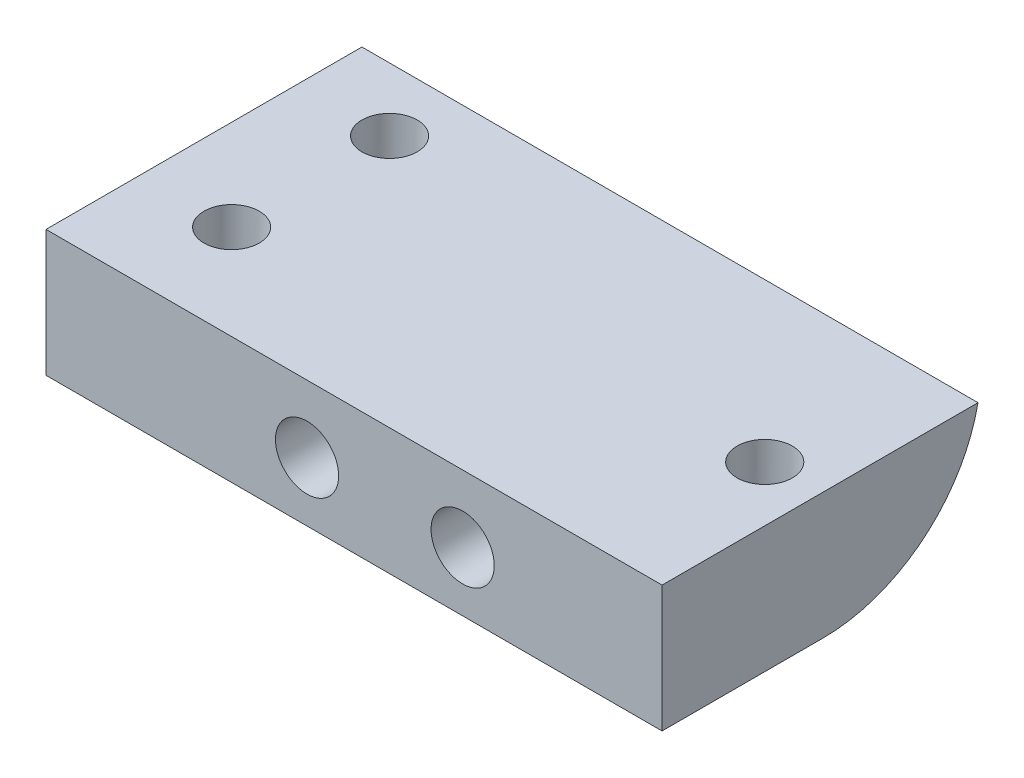
ISO-10303-21;
HEADER;
FILE_DESCRIPTION(('STEP AP214'),'2;1');
FILE_NAME('part.step','',(''),(''),'','','');
FILE_SCHEMA(('AUTOMOTIVE_DESIGN { 1 0 10303 214 1 1 1 1 }'));
ENDSEC;
DATA;
#1=APPLICATION_CONTEXT('core data for automotive mechanical design processes');
#2=APPLICATION_PROTOCOL_DEFINITION('international standard','automotive_design',2000,#1);
#3=PRODUCT_CONTEXT('',#1,'mechanical');
#4=PRODUCT('Part','Part','',(#3));
#5=PRODUCT_RELATED_PRODUCT_CATEGORY('part','',(#4));
#6=PRODUCT_DEFINITION_FORMATION('','',#4);
#7=PRODUCT_DEFINITION_CONTEXT('part definition',#1,'design');
#8=PRODUCT_DEFINITION('design','',#6,#7);
#9=PRODUCT_DEFINITION_SHAPE('','',#8);
#10=(LENGTH_UNIT() NAMED_UNIT(*) SI_UNIT(.MILLI.,.METRE.));
#11=(NAMED_UNIT(*) PLANE_ANGLE_UNIT() SI_UNIT($,.RADIAN.));
#12=(NAMED_UNIT(*) SI_UNIT($,.STERADIAN.) SOLID_ANGLE_UNIT());
#13=UNCERTAINTY_MEASURE_WITH_UNIT(LENGTH_MEASURE(1.E-05),#10,'distance_accuracy_value','');
#14=(GEOMETRIC_REPRESENTATION_CONTEXT(3) GLOBAL_UNCERTAINTY_ASSIGNED_CONTEXT((#13)) GLOBAL_UNIT_ASSIGNED_CONTEXT((#10,
#11,#12)) REPRESENTATION_CONTEXT('',''));
#15=CARTESIAN_POINT('',(0.,0.,0.));
#16=DIRECTION('',(0.,0.,1.));
#17=DIRECTION('',(1.,0.,0.));
#18=AXIS2_PLACEMENT_3D('',#15,#16,#17);
#19=CARTESIAN_POINT('',(-0.885282092778937,3.79686795239579,4.));
#20=DIRECTION('',(0.,1.,0.));
#21=DIRECTION('',(0.,0.,1.));
#22=AXIS2_PLACEMENT_3D('',#19,#20,#21);
#23=CYLINDRICAL_SURFACE('',#22,1.75);
#24=CARTESIAN_POINT('',(-0.885282092778937,11.7978679523958,4.));
#25=DIRECTION('',(0.,1.,0.));
#26=DIRECTION('',(0.,0.,1.));
#27=AXIS2_PLACEMENT_3D('',#24,#25,#26);
#28=CIRCLE('',#27,1.75);
#29=CARTESIAN_POINT('',(-0.885282092778937,11.7978679523958,5.75));
#30=VERTEX_POINT('',#29);
#31=EDGE_CURVE('E199',#30,#30,#28,.T.);
#32=ORIENTED_EDGE('',*,*,#31,.T.);
#33=EDGE_LOOP('',(#32));
#34=FACE_BOUND('',#33,.T.);
#35=CARTESIAN_POINT('',(-0.885282092778937,7.79786795239579,4.));
#36=DIRECTION('',(0.,-1.,0.));
#37=DIRECTION('',(0.,0.,-1.));
#38=AXIS2_PLACEMENT_3D('',#35,#36,#37);
#39=CIRCLE('',#38,1.75);
#40=CARTESIAN_POINT('',(-0.885282092778937,7.79786795239579,2.25));
#41=VERTEX_POINT('',#40);
#42=EDGE_CURVE('E195',#41,#41,#39,.F.);
#43=ORIENTED_EDGE('',*,*,#42,.F.);
#44=EDGE_LOOP('',(#43));
#45=FACE_BOUND('',#44,.T.);
#46=ADVANCED_FACE('F33',(#34,#45),#23,.F.);
#47=CARTESIAN_POINT('',(-0.885282092778937,3.79686795239579,14.));
#48=DIRECTION('',(0.,1.,0.));
#49=DIRECTION('',(0.,0.,1.));
#50=AXIS2_PLACEMENT_3D('',#47,#48,#49);
#51=CYLINDRICAL_SURFACE('',#50,1.75);
#52=CARTESIAN_POINT('',(-0.885282092778937,11.7978679523958,14.));
#53=DIRECTION('',(0.,1.,0.));
#54=DIRECTION('',(0.,0.,1.));
#55=AXIS2_PLACEMENT_3D('',#52,#53,#54);
#56=CIRCLE('',#55,1.75);
#57=CARTESIAN_POINT('',(-0.885282092778937,11.7978679523958,15.75));
#58=VERTEX_POINT('',#57);
#59=EDGE_CURVE('E213',#58,#58,#56,.T.);
#60=ORIENTED_EDGE('',*,*,#59,.T.);
#61=EDGE_LOOP('',(#60));
#62=FACE_BOUND('',#61,.T.);
#63=CARTESIAN_POINT('',(-0.885282092778937,7.79786795239579,14.));
#64=DIRECTION('',(0.,-1.,0.));
#65=DIRECTION('',(0.,0.,-1.));
#66=AXIS2_PLACEMENT_3D('',#63,#64,#65);
#67=CIRCLE('',#66,1.75);
#68=CARTESIAN_POINT('',(-0.885282092778937,7.79786795239579,12.25));
#69=VERTEX_POINT('',#68);
#70=EDGE_CURVE('E38',#69,#69,#67,.F.);
#71=ORIENTED_EDGE('',*,*,#70,.F.);
#72=EDGE_LOOP('',(#71));
#73=FACE_BOUND('',#72,.T.);
#74=ADVANCED_FACE('F160',(#62,#73),#51,.F.);
#75=CARTESIAN_POINT('',(28.8647179072211,3.79686795239579,10.));
#76=DIRECTION('',(0.,1.,0.));
#77=DIRECTION('',(0.,0.,1.));
#78=AXIS2_PLACEMENT_3D('',#75,#76,#77);
#79=CYLINDRICAL_SURFACE('',#78,1.75);
#80=CARTESIAN_POINT('',(28.8647179072211,11.7978679523958,10.));
#81=DIRECTION('',(0.,1.,0.));
#82=DIRECTION('',(0.,0.,1.));
#83=AXIS2_PLACEMENT_3D('',#80,#81,#82);
#84=CIRCLE('',#83,1.75);
#85=CARTESIAN_POINT('',(28.8647179072211,11.7978679523958,11.75));
#86=VERTEX_POINT('',#85);
#87=EDGE_CURVE('E210',#86,#86,#84,.T.);
#88=ORIENTED_EDGE('',*,*,#87,.T.);
#89=EDGE_LOOP('',(#88));
#90=FACE_BOUND('',#89,.T.);
#91=CARTESIAN_POINT('',(28.8647179072211,7.79786795239579,10.));
#92=DIRECTION('',(0.,-1.,0.));
#93=DIRECTION('',(0.,0.,-1.));
#94=AXIS2_PLACEMENT_3D('',#91,#92,#93);
#95=CIRCLE('',#94,1.75);
#96=CARTESIAN_POINT('',(28.8647179072211,7.79786795239579,8.25));
#97=VERTEX_POINT('',#96);
#98=EDGE_CURVE('E193',#97,#97,#95,.F.);
#99=ORIENTED_EDGE('',*,*,#98,.F.);
#100=EDGE_LOOP('',(#99));
#101=FACE_BOUND('',#100,.T.);
#102=ADVANCED_FACE('F143',(#90,#101),#79,.F.);
#103=CARTESIAN_POINT('',(0.,0.,20.));
#104=DIRECTION('',(0.,0.,1.));
#105=DIRECTION('',(1.,0.,0.));
#106=AXIS2_PLACEMENT_3D('',#103,#104,#105);
#107=PLANE('',#106);
#108=CARTESIAN_POINT('',(9.88971790722106,7.54786795239579,20.));
#109=DIRECTION('',(0.,0.,1.));
#110=DIRECTION('',(1.,0.,0.));
#111=AXIS2_PLACEMENT_3D('',#108,#109,#110);
#112=CIRCLE('',#111,2.);
#113=CARTESIAN_POINT('',(11.8897179072211,7.54786795239579,20.));
#114=VERTEX_POINT('',#113);
#115=EDGE_CURVE('E123',#114,#114,#112,.T.);
#116=ORIENTED_EDGE('',*,*,#115,.F.);
#117=EDGE_LOOP('',(#116));
#118=FACE_BOUND('',#117,.T.);
#119=DIRECTION('',(0.,-1.,0.));
#120=VECTOR('',#119,1.);
#121=CARTESIAN_POINT('',(-6.63528209277894,11.7978679523958,20.));
#122=LINE('',#121,#120);
#123=CARTESIAN_POINT('',(-6.63528209277894,11.7978679523958,20.));
#124=VERTEX_POINT('',#123);
#125=CARTESIAN_POINT('',(-6.63528209277894,3.79786795239579,20.));
#126=VERTEX_POINT('',#125);
#127=EDGE_CURVE('E222',#124,#126,#122,.T.);
#128=ORIENTED_EDGE('',*,*,#127,.T.);
#129=DIRECTION('',(1.,0.,0.));
#130=VECTOR('',#129,1.);
#131=CARTESIAN_POINT('',(-6.63528209277894,3.79786795239579,20.));
#132=LINE('',#131,#130);
#133=CARTESIAN_POINT('',(32.3647179072211,3.79786795239579,20.));
#134=VERTEX_POINT('',#133);
#135=EDGE_CURVE('E225',#126,#134,#132,.T.);
#136=ORIENTED_EDGE('',*,*,#135,.T.);
#137=DIRECTION('',(0.,1.,0.));
#138=VECTOR('',#137,1.);
#139=CARTESIAN_POINT('',(32.3647179072211,11.7978679523958,20.));
#140=LINE('',#139,#138);
#141=CARTESIAN_POINT('',(32.3647179072211,11.7978679523958,20.));
#142=VERTEX_POINT('',#141);
#143=EDGE_CURVE('E227',#134,#142,#140,.T.);
#144=ORIENTED_EDGE('',*,*,#143,.T.);
#145=DIRECTION('',(-1.,0.,0.));
#146=VECTOR('',#145,1.);
#147=CARTESIAN_POINT('',(-6.63528209277894,11.7978679523958,20.));
#148=LINE('',#147,#146);
#149=EDGE_CURVE('E229',#142,#124,#148,.T.);
#150=ORIENTED_EDGE('',*,*,#149,.T.);
#151=EDGE_LOOP('',(#128,#136,#144,#150));
#152=FACE_BOUND('',#151,.T.);
#153=CARTESIAN_POINT('',(19.7397179072211,7.54786795239579,20.));
#154=DIRECTION('',(0.,0.,1.));
#155=DIRECTION('',(1.,0.,0.));
#156=AXIS2_PLACEMENT_3D('',#153,#154,#155);
#157=CIRCLE('',#156,2.);
#158=CARTESIAN_POINT('',(21.7397179072211,7.54786795239579,20.));
#159=VERTEX_POINT('',#158);
#160=EDGE_CURVE('E124',#159,#159,#157,.T.);
#161=ORIENTED_EDGE('',*,*,#160,.F.);
#162=EDGE_LOOP('',(#161));
#163=FACE_BOUND('',#162,.T.);
#164=ADVANCED_FACE('F139',(#118,#152,#163),#107,.T.);
#165=CARTESIAN_POINT('',(-6.63528209277894,11.7978679523958,20.));
#166=DIRECTION('',(1.,0.,0.));
#167=DIRECTION('',(0.,1.,0.));
#168=AXIS2_PLACEMENT_3D('',#165,#166,#167);
#169=PLANE('',#168);
#170=DIRECTION('',(0.,0.,-1.));
#171=VECTOR('',#170,1.);
#172=CARTESIAN_POINT('',(-6.63528209277894,11.7978679523958,20.));
#173=LINE('',#172,#171);
#174=CARTESIAN_POINT('',(-6.63528209277894,11.7978679523958,0.));
#175=VERTEX_POINT('',#174);
#176=EDGE_CURVE('E231',#124,#175,#173,.T.);
#177=ORIENTED_EDGE('',*,*,#176,.T.);
#178=CARTESIAN_POINT('',(-6.63528209277894,13.7978679523958,9.79795897113271));
#179=DIRECTION('',(1.,0.,0.));
#180=DIRECTION('',(0.,1.,0.));
#181=AXIS2_PLACEMENT_3D('',#178,#179,#180);
#182=CIRCLE('',#181,10.);
#183=CARTESIAN_POINT('',(-6.63528209277894,3.79786795239579,9.79795897113271));
#184=VERTEX_POINT('',#183);
#185=EDGE_CURVE('E92',#175,#184,#182,.F.);
#186=ORIENTED_EDGE('',*,*,#185,.T.);
#187=DIRECTION('',(0.,0.,-1.));
#188=VECTOR('',#187,1.);
#189=CARTESIAN_POINT('',(-6.63528209277894,3.79786795239579,20.));
#190=LINE('',#189,#188);
#191=EDGE_CURVE('E107',#126,#184,#190,.T.);
#192=ORIENTED_EDGE('',*,*,#191,.F.);
#193=ORIENTED_EDGE('',*,*,#127,.F.);
#194=EDGE_LOOP('',(#177,#186,#192,#193));
#195=FACE_BOUND('',#194,.T.);
#196=ADVANCED_FACE('F142',(#195),#169,.F.);
#197=CARTESIAN_POINT('',(-6.63528209277894,3.79786795239579,20.));
#198=DIRECTION('',(0.,1.,0.));
#199=DIRECTION('',(0.,0.,1.));
#200=AXIS2_PLACEMENT_3D('',#197,#198,#199);
#201=PLANE('',#200);
#202=CARTESIAN_POINT('',(-0.885282092778937,3.79786795239579,14.));
#203=DIRECTION('',(0.,-1.,0.));
#204=DIRECTION('',(0.,0.,-1.));
#205=AXIS2_PLACEMENT_3D('',#202,#203,#204);
#206=CIRCLE('',#205,3.1);
#207=CARTESIAN_POINT('',(-0.885282092778937,3.79786795239579,10.9));
#208=VERTEX_POINT('',#207);
#209=EDGE_CURVE('E206',#208,#208,#206,.T.);
#210=ORIENTED_EDGE('',*,*,#209,.F.);
#211=EDGE_LOOP('',(#210));
#212=FACE_BOUND('',#211,.T.);
#213=DIRECTION('',(1.,0.,0.));
#214=VECTOR('',#213,1.);
#215=CARTESIAN_POINT('',(-6.63528209277894,3.79786795239579,9.79795897113271));
#216=LINE('',#215,#214);
#217=CARTESIAN_POINT('',(25.771308877905,3.79786795239579,9.79795897113271));
#218=VERTEX_POINT('',#217);
#219=EDGE_CURVE('E100',#184,#218,#216,.T.);
#220=ORIENTED_EDGE('',*,*,#219,.T.);
#221=CARTESIAN_POINT('',(28.8647179072211,3.79786795239579,10.));
#222=DIRECTION('',(0.,-1.,0.));
#223=DIRECTION('',(0.,0.,-1.));
#224=AXIS2_PLACEMENT_3D('',#221,#222,#223);
#225=CIRCLE('',#224,3.1);
#226=CARTESIAN_POINT('',(31.9581269365371,3.79786795239579,9.79795897113271));
#227=VERTEX_POINT('',#226);
#228=EDGE_CURVE('E56',#227,#218,#225,.T.);
#229=ORIENTED_EDGE('',*,*,#228,.F.);
#230=DIRECTION('',(1.,0.,0.));
#231=VECTOR('',#230,1.);
#232=CARTESIAN_POINT('',(-6.63528209277894,3.79786795239579,9.79795897113271));
#233=LINE('',#232,#231);
#234=CARTESIAN_POINT('',(32.3647179072211,3.79786795239579,9.79795897113271));
#235=VERTEX_POINT('',#234);
#236=EDGE_CURVE('E97',#227,#235,#233,.T.);
#237=ORIENTED_EDGE('',*,*,#236,.T.);
#238=DIRECTION('',(0.,0.,-1.));
#239=VECTOR('',#238,1.);
#240=CARTESIAN_POINT('',(32.3647179072211,3.79786795239579,20.));
#241=LINE('',#240,#239);
#242=EDGE_CURVE('E110',#134,#235,#241,.T.);
#243=ORIENTED_EDGE('',*,*,#242,.F.);
#244=ORIENTED_EDGE('',*,*,#135,.F.);
#245=ORIENTED_EDGE('',*,*,#191,.T.);
#246=EDGE_LOOP('',(#220,#229,#237,#243,#244,#245));
#247=FACE_BOUND('',#246,.T.);
#248=ADVANCED_FACE('F95',(#212,#247),#201,.F.);
#249=CARTESIAN_POINT('',(32.3647179072211,11.7978679523958,20.));
#250=DIRECTION('',(-1.,0.,0.));
#251=DIRECTION('',(0.,0.,1.));
#252=AXIS2_PLACEMENT_3D('',#249,#250,#251);
#253=PLANE('',#252);
#254=ORIENTED_EDGE('',*,*,#242,.T.);
#255=CARTESIAN_POINT('',(32.3647179072211,13.7978679523958,9.79795897113271));
#256=DIRECTION('',(-1.,0.,0.));
#257=DIRECTION('',(0.,0.,1.));
#258=AXIS2_PLACEMENT_3D('',#255,#256,#257);
#259=CIRCLE('',#258,10.);
#260=CARTESIAN_POINT('',(32.3647179072211,11.7978679523958,0.));
#261=VERTEX_POINT('',#260);
#262=EDGE_CURVE('E106',#235,#261,#259,.F.);
#263=ORIENTED_EDGE('',*,*,#262,.T.);
#264=DIRECTION('',(0.,0.,-1.));
#265=VECTOR('',#264,1.);
#266=CARTESIAN_POINT('',(32.3647179072211,11.7978679523958,20.));
#267=LINE('',#266,#265);
#268=EDGE_CURVE('E234',#142,#261,#267,.T.);
#269=ORIENTED_EDGE('',*,*,#268,.F.);
#270=ORIENTED_EDGE('',*,*,#143,.F.);
#271=EDGE_LOOP('',(#254,#263,#269,#270));
#272=FACE_BOUND('',#271,.T.);
#273=ADVANCED_FACE('F147',(#272),#253,.F.);
#274=CARTESIAN_POINT('',(-6.63528209277894,11.7978679523958,20.));
#275=DIRECTION('',(0.,-1.,0.));
#276=DIRECTION('',(0.,0.,-1.));
#277=AXIS2_PLACEMENT_3D('',#274,#275,#276);
#278=PLANE('',#277);
#279=ORIENTED_EDGE('',*,*,#87,.F.);
#280=EDGE_LOOP('',(#279));
#281=FACE_BOUND('',#280,.T.);
#282=ORIENTED_EDGE('',*,*,#59,.F.);
#283=EDGE_LOOP('',(#282));
#284=FACE_BOUND('',#283,.T.);
#285=ORIENTED_EDGE('',*,*,#31,.F.);
#286=EDGE_LOOP('',(#285));
#287=FACE_BOUND('',#286,.T.);
#288=DIRECTION('',(-1.,0.,0.));
#289=VECTOR('',#288,1.);
#290=CARTESIAN_POINT('',(-6.63528209277894,11.7978679523958,0.));
#291=LINE('',#290,#289);
#292=EDGE_CURVE('E221',#261,#175,#291,.T.);
#293=ORIENTED_EDGE('',*,*,#292,.T.);
#294=ORIENTED_EDGE('',*,*,#176,.F.);
#295=ORIENTED_EDGE('',*,*,#149,.F.);
#296=ORIENTED_EDGE('',*,*,#268,.T.);
#297=EDGE_LOOP('',(#293,#294,#295,#296));
#298=FACE_BOUND('',#297,.T.);
#299=ADVANCED_FACE('F135',(#281,#284,#287,#298),#278,.F.);
#300=CARTESIAN_POINT('',(9.88971790722106,7.54786795239579,20.));
#301=DIRECTION('',(0.,0.,-1.));
#302=DIRECTION('',(-1.,0.,0.));
#303=AXIS2_PLACEMENT_3D('',#300,#301,#302);
#304=CYLINDRICAL_SURFACE('',#303,2.);
#305=ORIENTED_EDGE('',*,*,#115,.T.);
#306=EDGE_LOOP('',(#305));
#307=FACE_BOUND('',#306,.T.);
#308=CARTESIAN_POINT('',(8.06706713452882,8.37124159832121,1.39845146097099));
#309=CARTESIAN_POINT('',(8.03684840403237,8.30434313191308,1.44167383921874));
#310=CARTESIAN_POINT('',(8.01070371922054,8.23664322015132,1.48655043794439));
#311=CARTESIAN_POINT('',(7.96628275027579,8.10061553952446,1.57919229547365));
#312=CARTESIAN_POINT('',(7.94801321392808,8.03228728325485,1.62695999169866));
#313=CARTESIAN_POINT('',(7.90437238311397,7.82711414357992,1.77434663642538));
#314=CARTESIAN_POINT('',(7.89034402169671,7.69048724323069,1.87778849023849));
#315=CARTESIAN_POINT('',(7.88906368612502,7.40811192355309,2.10333011330868));
#316=CARTESIAN_POINT('',(7.90494558743367,7.26302650368383,2.22622799586738));
#317=CARTESIAN_POINT('',(7.96568742907636,6.98343871907239,2.47684024413229));
#318=CARTESIAN_POINT('',(8.0105585403283,6.84894045648772,2.60455644869467));
#319=CARTESIAN_POINT('',(8.09804184445983,6.65626652154989,2.79753029846761));
#320=CARTESIAN_POINT('',(8.13085053201474,6.59316860126641,2.86252167073016));
#321=CARTESIAN_POINT('',(8.20315124999806,6.47057706504911,2.99217144525225));
#322=CARTESIAN_POINT('',(8.24264071200764,6.41108207586274,3.0568299656698));
#323=CARTESIAN_POINT('',(8.32828315761671,6.2960452169771,3.18508731754283));
#324=CARTESIAN_POINT('',(8.37442861469255,6.24049898658284,3.24868725661778));
#325=CARTESIAN_POINT('',(8.47360444702865,6.13367892559521,3.3740208944851));
#326=CARTESIAN_POINT('',(8.5266308510256,6.08240265844842,3.43575564460868));
#327=CARTESIAN_POINT('',(8.64902642423236,5.97680849475583,3.56585616683012));
#328=CARTESIAN_POINT('',(8.71965348019377,5.92330461898732,3.63371425686979));
#329=CARTESIAN_POINT('',(8.87165787449071,5.82398218637763,3.76275036923891));
#330=CARTESIAN_POINT('',(8.95302139950198,5.77815392332547,3.82393679352143));
#331=CARTESIAN_POINT('',(9.10605828855624,5.70635824440362,3.92171765583146));
#332=CARTESIAN_POINT('',(9.1752129500256,5.67827653517361,3.96066281357448));
#333=CARTESIAN_POINT('',(9.32019681286711,5.62915141059759,4.02960892405375));
#334=CARTESIAN_POINT('',(9.39601376439686,5.60809540567515,4.0596258649391));
#335=CARTESIAN_POINT('',(9.53701188650633,5.57818192620844,4.10258308748956));
#336=CARTESIAN_POINT('',(9.60115333173919,5.56770282164011,4.11777038933889));
#337=CARTESIAN_POINT('',(9.73162331195037,5.5530493587498,4.13905979123538));
#338=CARTESIAN_POINT('',(9.79794959120912,5.54886869398012,4.14517097884901));
#339=CARTESIAN_POINT('',(9.9310185609371,5.5471855948123,4.14762763393258));
#340=CARTESIAN_POINT('',(9.99776184146238,5.54969760797718,4.14395197443057));
#341=CARTESIAN_POINT('',(10.129495552086,5.56118947051188,4.12722494813168));
#342=CARTESIAN_POINT('',(10.1944844417527,5.5701748236472,4.11416560315909));
#343=CARTESIAN_POINT('',(10.3365924075314,5.59678492783064,4.0758181088091));
#344=CARTESIAN_POINT('',(10.4128133687158,5.61598027784545,4.04832702137449));
#345=CARTESIAN_POINT('',(10.558870638318,5.66156962265168,3.98399262587635));
#346=CARTESIAN_POINT('',(10.6286933269441,5.68797851814815,3.94712997041408));
#347=CARTESIAN_POINT('',(10.796875764961,5.76197518714132,3.84563732242049));
#348=CARTESIAN_POINT('',(10.8908660112933,5.81338723672818,3.77661589534837));
#349=CARTESIAN_POINT('',(11.0649277912908,5.92623990535108,3.62980594626759));
#350=CARTESIAN_POINT('',(11.1449641295273,5.98770514625471,3.55199604843084));
#351=CARTESIAN_POINT('',(11.2742359123618,6.10266136958501,3.41125981483677));
#352=CARTESIAN_POINT('',(11.3262076065718,6.15440143610911,3.34937346253681));
#353=CARTESIAN_POINT('',(11.4233395343652,6.26207361634839,3.223870407996));
#354=CARTESIAN_POINT('',(11.4684965630168,6.31800768410363,3.16025290809567));
#355=CARTESIAN_POINT('',(11.5521820380131,6.4337262588288,3.03209812992432));
#356=CARTESIAN_POINT('',(11.5907070106654,6.49351276120705,2.96756038870168));
#357=CARTESIAN_POINT('',(11.661109769403,6.61663244317661,2.83822839985937));
#358=CARTESIAN_POINT('',(11.6929850519517,6.67996694720942,2.7734340649564));
#359=CARTESIAN_POINT('',(11.7796131969431,6.87757946250146,2.57684561230161));
#360=CARTESIAN_POINT('',(11.8236903165677,7.01714715268273,2.44544097528138));
#361=CARTESIAN_POINT('',(11.8806523094256,7.30715715388089,2.18822099898585));
#362=CARTESIAN_POINT('',(11.8935877802272,7.45758141540277,2.06239691967642));
#363=CARTESIAN_POINT('',(11.8849827321834,7.72885849223791,1.84876949120459));
#364=CARTESIAN_POINT('',(11.8708189939144,7.84836891350585,1.75897195597682));
#365=CARTESIAN_POINT('',(11.8192962610595,8.08795393541835,1.5870817578377));
#366=CARTESIAN_POINT('',(11.7819661239353,8.20802764999484,1.50497965526388));
#367=CARTESIAN_POINT('',(11.6902681564626,8.42512892739424,1.3630470051313));
#368=CARTESIAN_POINT('',(11.6396013579732,8.52275967673197,1.3017575280009));
#369=CARTESIAN_POINT('',(11.5201091781366,8.71160729000116,1.18737714739777));
#370=CARTESIAN_POINT('',(11.451288263743,8.80282572474656,1.13428423218822));
#371=CARTESIAN_POINT('',(11.2954996380895,8.97522672132363,1.0371368117435));
#372=CARTESIAN_POINT('',(11.2084218706267,9.05634343060684,0.99314049295234));
#373=CARTESIAN_POINT('',(11.0182555167431,9.20341028579624,0.915509810037765));
#374=CARTESIAN_POINT('',(10.9151755318249,9.2693685327005,0.881869907949883));
#375=CARTESIAN_POINT('',(10.7089068072316,9.37565936029879,0.828722392969982));
#376=CARTESIAN_POINT('',(10.6070846536291,9.41806256008998,0.808036921413673));
#377=CARTESIAN_POINT('',(10.396581196682,9.48572544987975,0.775384197319473));
#378=CARTESIAN_POINT('',(10.2879031337039,9.5109931733865,0.763412859200562));
#379=CARTESIAN_POINT('',(10.0749956447425,9.54196774307373,0.748783188174038));
#380=CARTESIAN_POINT('',(9.97098548825754,9.54891728229886,0.745532918261145));
#381=CARTESIAN_POINT('',(9.76319917015645,9.54656265622635,0.7466382147233));
#382=CARTESIAN_POINT('',(9.65942296807273,9.53726155912013,0.750992345354106));
#383=CARTESIAN_POINT('',(9.45712501358356,9.50316489374229,0.767130358772276));
#384=CARTESIAN_POINT('',(9.35854061593182,9.47867044646765,0.778769890130435));
#385=CARTESIAN_POINT('',(9.16722198191219,9.41552612890989,0.809282733511133));
#386=CARTESIAN_POINT('',(9.0744873559411,9.37687720250473,0.828155563191969));
#387=CARTESIAN_POINT('',(8.89564975609166,9.28627249757092,0.873380466979585));
#388=CARTESIAN_POINT('',(8.80968911000281,9.23409826550997,0.899856176480283));
#389=CARTESIAN_POINT('',(8.64809221646538,9.11892492256977,0.959876673364413));
#390=CARTESIAN_POINT('',(8.57246120689919,9.05592035621934,0.993425025327038));
#391=CARTESIAN_POINT('',(8.42876445055972,8.91758910333795,1.06930218852977));
#392=CARTESIAN_POINT('',(8.36139724817969,8.84175805283822,1.11202900056343));
#393=CARTESIAN_POINT('',(8.24049755832887,8.68363485707528,1.20418431327085));
#394=CARTESIAN_POINT('',(8.18694959305393,8.60135007603825,1.25360522095985));
#395=CARTESIAN_POINT('',(8.11365787760933,8.46908610848271,1.33584830049209));
#396=CARTESIAN_POINT('',(8.08926348362562,8.42038005285062,1.36670363501602));
#397=CARTESIAN_POINT('',(8.06706713452882,8.37124159832121,1.39845146097099));
#398=B_SPLINE_CURVE_WITH_KNOTS('',3,(#308,#309,#310,#311,#312,#313,#314,#315,#316,#317,#318,
#319,#320,#321,#322,#323,#324,#325,#326,#327,#328,#329,#330,#331,#332,#333,#334,#335,#336,#337,
#338,#339,#340,#341,#342,#343,#344,#345,#346,#347,#348,#349,#350,#351,#352,#353,#354,#355,#356,
#357,#358,#359,#360,#361,#362,#363,#364,#365,#366,#367,#368,#369,#370,#371,#372,#373,#374,#375,
#376,#377,#378,#379,#380,#381,#382,#383,#384,#385,#386,#387,#388,#389,#390,#391,#392,#393,#394,
#395,#396,#397),.UNSPECIFIED.,.T.,.F.,(4,2,2,2,2,2,2,2,2,2,2,2,2,2,2,2,2,2,2,2,2,2,2,2,2,2,2,2,
2,2,2,2,2,2,2,2,2,2,2,2,2,2,2,2,4),(0.,0.255491071982921,0.511200627260808,1.02413565654776,
1.59381515462571,2.163714308285,2.45250019619512,2.74117531183391,3.02952651946682,
3.31771204242053,3.65174783012232,3.98535796970025,4.23713480346648,4.48845801675372,
4.68784643525911,4.8870350788481,5.08665406152812,5.28644296493177,5.53486488228596,
5.78380388611113,6.16402622927968,6.545194139023,6.83271548200721,7.12037162744736,
7.40817798402832,7.69609250182189,8.28338586514439,8.86972437438288,9.31849455623655,
9.76670684190924,10.1429061897785,10.5190130572383,10.8974559531392,11.2756961285114,
11.6105842934499,11.9453153463191,12.2566727940372,12.5679714624558,12.8732893003509,
13.178586782123,13.4891611212393,13.7998923642037,14.1287473566934,14.457232411074,
14.6448964502869),.UNSPECIFIED.);
#399=CARTESIAN_POINT('',(8.06706713452882,8.37124159832121,1.39845146097099));
#400=VERTEX_POINT('',#399);
#401=EDGE_CURVE('E116',#400,#400,#398,.T.);
#402=ORIENTED_EDGE('',*,*,#401,.F.);
#403=EDGE_LOOP('',(#402));
#404=FACE_BOUND('',#403,.T.);
#405=ADVANCED_FACE('F130',(#307,#404),#304,.F.);
#406=CARTESIAN_POINT('',(19.7397179072211,7.54786795239579,20.));
#407=DIRECTION('',(0.,0.,-1.));
#408=DIRECTION('',(-1.,0.,0.));
#409=AXIS2_PLACEMENT_3D('',#406,#407,#408);
#410=CYLINDRICAL_SURFACE('',#409,2.);
#411=ORIENTED_EDGE('',*,*,#160,.T.);
#412=EDGE_LOOP('',(#411));
#413=FACE_BOUND('',#412,.T.);
#414=CARTESIAN_POINT('',(17.9170671345288,8.37124159832121,1.39845146097099));
#415=CARTESIAN_POINT('',(17.8868484040324,8.30434313191308,1.44167383921874));
#416=CARTESIAN_POINT('',(17.8607037192205,8.23664322015131,1.48655043794439));
#417=CARTESIAN_POINT('',(17.8162827502758,8.10061553952446,1.57919229547365));
#418=CARTESIAN_POINT('',(17.7980132139281,8.03228728325485,1.62695999169866));
#419=CARTESIAN_POINT('',(17.754372383114,7.82711414357992,1.77434663642539));
#420=CARTESIAN_POINT('',(17.7403440216967,7.69048724323069,1.87778849023849));
#421=CARTESIAN_POINT('',(17.739063686125,7.40811192355309,2.10333011330868));
#422=CARTESIAN_POINT('',(17.7549455874337,7.26302650368383,2.22622799586739));
#423=CARTESIAN_POINT('',(17.8156874290764,6.98343871907239,2.4768402441323));
#424=CARTESIAN_POINT('',(17.8605585403283,6.84894045648772,2.60455644869467));
#425=CARTESIAN_POINT('',(17.9480418444598,6.65626652154989,2.79753029846761));
#426=CARTESIAN_POINT('',(17.9808505320147,6.59316860126641,2.86252167073016));
#427=CARTESIAN_POINT('',(18.0531512499981,6.47057706504911,2.99217144525225));
#428=CARTESIAN_POINT('',(18.0926407120076,6.41108207586274,3.0568299656698));
#429=CARTESIAN_POINT('',(18.1782831576167,6.29604521697709,3.18508731754284));
#430=CARTESIAN_POINT('',(18.2244286146926,6.24049898658284,3.24868725661778));
#431=CARTESIAN_POINT('',(18.3236044470286,6.13367892559521,3.3740208944851));
#432=CARTESIAN_POINT('',(18.3766308510256,6.08240265844842,3.43575564460868));
#433=CARTESIAN_POINT('',(18.4990264242324,5.97680849475583,3.56585616683012));
#434=CARTESIAN_POINT('',(18.5696534801938,5.92330461898732,3.63371425686979));
#435=CARTESIAN_POINT('',(18.7216578744907,5.82398218637763,3.76275036923891));
#436=CARTESIAN_POINT('',(18.803021399502,5.77815392332546,3.82393679352144));
#437=CARTESIAN_POINT('',(18.9560582885562,5.70635824440362,3.92171765583146));
#438=CARTESIAN_POINT('',(19.0252129500256,5.67827653517361,3.96066281357448));
#439=CARTESIAN_POINT('',(19.1701968128671,5.62915141059759,4.02960892405375));
#440=CARTESIAN_POINT('',(19.2460137643968,5.60809540567515,4.0596258649391));
#441=CARTESIAN_POINT('',(19.3870118865063,5.57818192620844,4.10258308748956));
#442=CARTESIAN_POINT('',(19.4511533317392,5.56770282164011,4.11777038933889));
#443=CARTESIAN_POINT('',(19.5816233119504,5.5530493587498,4.13905979123538));
#444=CARTESIAN_POINT('',(19.6479495912091,5.54886869398012,4.14517097884901));
#445=CARTESIAN_POINT('',(19.7810185609371,5.5471855948123,4.14762763393258));
#446=CARTESIAN_POINT('',(19.8477618414624,5.54969760797718,4.14395197443057));
#447=CARTESIAN_POINT('',(19.979495552086,5.56118947051188,4.12722494813168));
#448=CARTESIAN_POINT('',(20.0444844417527,5.5701748236472,4.1141656031591));
#449=CARTESIAN_POINT('',(20.1865924075314,5.59678492783063,4.0758181088091));
#450=CARTESIAN_POINT('',(20.2628133687158,5.61598027784545,4.04832702137449));
#451=CARTESIAN_POINT('',(20.408870638318,5.66156962265168,3.98399262587635));
#452=CARTESIAN_POINT('',(20.4786933269441,5.68797851814815,3.94712997041408));
#453=CARTESIAN_POINT('',(20.6468757649609,5.76197518714132,3.84563732242049));
#454=CARTESIAN_POINT('',(20.7408660112933,5.81338723672817,3.77661589534838));
#455=CARTESIAN_POINT('',(20.9149277912908,5.92623990535108,3.6298059462676));
#456=CARTESIAN_POINT('',(20.9949641295273,5.98770514625471,3.55199604843085));
#457=CARTESIAN_POINT('',(21.1242359123618,6.102661369585,3.41125981483678));
#458=CARTESIAN_POINT('',(21.1762076065718,6.1544014361091,3.34937346253682));
#459=CARTESIAN_POINT('',(21.2733395343652,6.26207361634838,3.22387040799601));
#460=CARTESIAN_POINT('',(21.3184965630168,6.31800768410362,3.16025290809568));
#461=CARTESIAN_POINT('',(21.4021820380131,6.43372625882879,3.03209812992433));
#462=CARTESIAN_POINT('',(21.4407070106654,6.49351276120704,2.96756038870169));
#463=CARTESIAN_POINT('',(21.511109769403,6.6166324431766,2.83822839985938));
#464=CARTESIAN_POINT('',(21.5429850519517,6.67996694720942,2.77343406495641));
#465=CARTESIAN_POINT('',(21.6296131969431,6.87757946250145,2.57684561230162));
#466=CARTESIAN_POINT('',(21.6736903165677,7.01714715268272,2.44544097528139));
#467=CARTESIAN_POINT('',(21.7306523094256,7.30715715388088,2.18822099898586));
#468=CARTESIAN_POINT('',(21.7435877802272,7.45758141540276,2.06239691967643));
#469=CARTESIAN_POINT('',(21.7349827321834,7.7288584922379,1.8487694912046));
#470=CARTESIAN_POINT('',(21.7208189939144,7.84836891350584,1.75897195597683));
#471=CARTESIAN_POINT('',(21.6692962610595,8.08795393541834,1.5870817578377));
#472=CARTESIAN_POINT('',(21.6319661239353,8.20802764999483,1.50497965526389));
#473=CARTESIAN_POINT('',(21.5402681564626,8.42512892739423,1.3630470051313));
#474=CARTESIAN_POINT('',(21.4896013579732,8.52275967673196,1.30175752800091));
#475=CARTESIAN_POINT('',(21.3701091781366,8.71160729000115,1.18737714739777));
#476=CARTESIAN_POINT('',(21.301288263743,8.80282572474656,1.13428423218822));
#477=CARTESIAN_POINT('',(21.1454996380895,8.97522672132362,1.0371368117435));
#478=CARTESIAN_POINT('',(21.0584218706267,9.05634343060684,0.993140492952341));
#479=CARTESIAN_POINT('',(20.8682555167431,9.20341028579623,0.915509810037766));
#480=CARTESIAN_POINT('',(20.7651755318249,9.26936853270049,0.881869907949884));
#481=CARTESIAN_POINT('',(20.5589068072317,9.37565936029879,0.828722392969983));
#482=CARTESIAN_POINT('',(20.4570846536291,9.41806256008998,0.808036921413674));
#483=CARTESIAN_POINT('',(20.246581196682,9.48572544987975,0.775384197319474));
#484=CARTESIAN_POINT('',(20.1379031337039,9.5109931733865,0.763412859200563));
#485=CARTESIAN_POINT('',(19.9249956447425,9.54196774307373,0.748783188174038));
#486=CARTESIAN_POINT('',(19.8209854882575,9.54891728229886,0.745532918261146));
#487=CARTESIAN_POINT('',(19.6131991701565,9.54656265622635,0.7466382147233));
#488=CARTESIAN_POINT('',(19.5094229680727,9.53726155912013,0.750992345354107));
#489=CARTESIAN_POINT('',(19.3071250135836,9.50316489374229,0.767130358772275));
#490=CARTESIAN_POINT('',(19.2085406159318,9.47867044646765,0.778769890130432));
#491=CARTESIAN_POINT('',(19.0172219819122,9.4155261289099,0.80928273351113));
#492=CARTESIAN_POINT('',(18.9244873559411,9.37687720250474,0.828155563191968));
#493=CARTESIAN_POINT('',(18.7456497560917,9.28627249757093,0.873380466979584));
#494=CARTESIAN_POINT('',(18.6596891100028,9.23409826550998,0.899856176480281));
#495=CARTESIAN_POINT('',(18.4980922164654,9.11892492256978,0.959876673364409));
#496=CARTESIAN_POINT('',(18.4224612068992,9.05592035621935,0.993425025327034));
#497=CARTESIAN_POINT('',(18.2787644505597,8.91758910333795,1.06930218852976));
#498=CARTESIAN_POINT('',(18.2113972481797,8.84175805283823,1.11202900056343));
#499=CARTESIAN_POINT('',(18.0904975583289,8.68363485707529,1.20418431327085));
#500=CARTESIAN_POINT('',(18.0369495930539,8.60135007603826,1.25360522095985));
#501=CARTESIAN_POINT('',(17.9636578776093,8.46908610848271,1.33584830049209));
#502=CARTESIAN_POINT('',(17.9392634836256,8.42038005285062,1.36670363501601));
#503=CARTESIAN_POINT('',(17.9170671345288,8.37124159832121,1.39845146097099));
#504=B_SPLINE_CURVE_WITH_KNOTS('',3,(#414,#415,#416,#417,#418,#419,#420,#421,#422,#423,#424,
#425,#426,#427,#428,#429,#430,#431,#432,#433,#434,#435,#436,#437,#438,#439,#440,#441,#442,#443,
#444,#445,#446,#447,#448,#449,#450,#451,#452,#453,#454,#455,#456,#457,#458,#459,#460,#461,#462,
#463,#464,#465,#466,#467,#468,#469,#470,#471,#472,#473,#474,#475,#476,#477,#478,#479,#480,#481,
#482,#483,#484,#485,#486,#487,#488,#489,#490,#491,#492,#493,#494,#495,#496,#497,#498,#499,#500,
#501,#502,#503),.UNSPECIFIED.,.T.,.F.,(4,2,2,2,2,2,2,2,2,2,2,2,2,2,2,2,2,2,2,2,2,2,2,2,2,2,2,2,
2,2,2,2,2,2,2,2,2,2,2,2,2,2,2,2,4),(0.,0.255491071982923,0.511200627260813,1.02413565654776,
1.59381515462572,2.163714308285,2.45250019619512,2.74117531183391,3.02952651946683,
3.31771204242053,3.65174783012232,3.98535796970025,4.23713480346648,4.48845801675371,
4.6878464352591,4.8870350788481,5.08665406152812,5.28644296493177,5.53486488228596,
5.78380388611113,6.16402622927969,6.54519413902299,6.83271548200721,7.12037162744735,
7.40817798402831,7.69609250182188,8.28338586514438,8.86972437438287,9.31849455623655,
9.76670684190924,10.1429061897785,10.5190130572383,10.8974559531392,11.2756961285114,
11.61058429345,11.9453153463191,12.2566727940372,12.5679714624558,12.8732893003509,
13.178586782123,13.4891611212393,13.7998923642037,14.1287473566934,14.457232411074,
14.6448964502869),.UNSPECIFIED.);
#505=CARTESIAN_POINT('',(17.9170671345288,8.37124159832121,1.39845146097099));
#506=VERTEX_POINT('',#505);
#507=EDGE_CURVE('E125',#506,#506,#504,.T.);
#508=ORIENTED_EDGE('',*,*,#507,.F.);
#509=EDGE_LOOP('',(#508));
#510=FACE_BOUND('',#509,.T.);
#511=ADVANCED_FACE('F134',(#413,#510),#410,.F.);
#512=CARTESIAN_POINT('',(0.,13.7978679523958,9.79795897113271));
#513=DIRECTION('',(1.,0.,0.));
#514=DIRECTION('',(0.,0.,-1.));
#515=AXIS2_PLACEMENT_3D('',#512,#513,#514);
#516=CYLINDRICAL_SURFACE('',#515,10.);
#517=CARTESIAN_POINT('',(1.29669300038439,7.79786795239579,1.79795897113271));
#518=CARTESIAN_POINT('',(1.33876033623397,7.7422779014315,1.83964998046535));
#519=CARTESIAN_POINT('',(1.37949742757105,7.68648996608459,1.88239792407766));
#520=CARTESIAN_POINT('',(1.45833155705256,7.57469438065993,1.96998681042701));
#521=CARTESIAN_POINT('',(1.49642865224825,7.51868673535784,2.01482770789949));
#522=CARTESIAN_POINT('',(1.60685672992809,7.35049797723885,2.15254048179596));
#523=CARTESIAN_POINT('',(1.6752519717042,7.23824758648692,2.24853042095423));
#524=CARTESIAN_POINT('',(1.80172181500999,7.01389804381692,2.44944806349));
#525=CARTESIAN_POINT('',(1.85970321071213,6.90180838437658,2.55444514509686));
#526=CARTESIAN_POINT('',(1.9638176077174,6.67996566218069,2.77231469339712));
#527=CARTESIAN_POINT('',(2.00995643563,6.57021147483134,2.88518325238292));
#528=CARTESIAN_POINT('',(2.11035683197841,6.29670478100169,3.18044311941677));
#529=CARTESIAN_POINT('',(2.15599090580166,6.13512056524672,3.3680109030794));
#530=CARTESIAN_POINT('',(2.19757966074825,5.90222160133278,3.66001898705209));
#531=CARTESIAN_POINT('',(2.20697057627922,5.8262588678931,3.75899834001359));
#532=CARTESIAN_POINT('',(2.21609418752647,5.67790022956858,3.96000266851581));
#533=CARTESIAN_POINT('',(2.21582869627677,5.60550365767681,4.0620270687409));
#534=CARTESIAN_POINT('',(2.20133725979808,5.42073934325587,4.33309433732438));
#535=CARTESIAN_POINT('',(2.17848206310148,5.3116980072925,4.50413635546973));
#536=CARTESIAN_POINT('',(2.12105080421357,5.15824407529395,4.76139366378061));
#537=CARTESIAN_POINT('',(2.09802884103079,5.10875160980362,4.84731197604858));
#538=CARTESIAN_POINT('',(2.04396507944125,5.01337173314138,5.01860781232024));
#539=CARTESIAN_POINT('',(2.01292729671886,4.96748253181044,5.10398558523911));
#540=CARTESIAN_POINT('',(1.94236269805967,4.87920080956017,5.27395352461208));
#541=CARTESIAN_POINT('',(1.90277403023244,4.83683705851306,5.35853299955105));
#542=CARTESIAN_POINT('',(1.81520078666388,4.75617947223526,5.52520409377224));
#543=CARTESIAN_POINT('',(1.76722024192775,4.71788369710013,5.60729688541182));
#544=CARTESIAN_POINT('',(1.66295594398472,4.64544734755363,5.76795119271131));
#545=CARTESIAN_POINT('',(1.60667375208367,4.61130599401132,5.84651336876357));
#546=CARTESIAN_POINT('',(1.48607194668386,4.54719257671596,5.99903171223797));
#547=CARTESIAN_POINT('',(1.42175341566229,4.51721995259106,6.07298849798952));
#548=CARTESIAN_POINT('',(1.29385965233381,4.46479734275268,6.20653925347592));
#549=CARTESIAN_POINT('',(1.23115476867508,4.44187565759167,6.26678379552288));
#550=CARTESIAN_POINT('',(1.10027601092076,4.39910130274096,6.38226312902433));
#551=CARTESIAN_POINT('',(1.03210035814502,4.37924963738017,6.43749627861558));
#552=CARTESIAN_POINT('',(0.890824764345479,4.34251946331332,6.54227648125562));
#553=CARTESIAN_POINT('',(0.817728050730198,4.32563903172632,6.5918272044862));
#554=CARTESIAN_POINT('',(0.667130510635082,4.29469491026504,6.68474580739946));
#555=CARTESIAN_POINT('',(0.589628103741934,4.2806322394699,6.72811144854008));
#556=CARTESIAN_POINT('',(0.360718440720316,4.24394712770649,6.84348862861937));
#557=CARTESIAN_POINT('',(0.204380384871548,4.22470490330489,6.90705940751971));
#558=CARTESIAN_POINT('',(-0.117193920982032,4.19477881277458,7.0080705586209));
#559=CARTESIAN_POINT('',(-0.282429373629137,4.18409418109816,7.0455132681559));
#560=CARTESIAN_POINT('',(-0.615702709505658,4.17068206179112,7.09279794242088));
#561=CARTESIAN_POINT('',(-0.783704997630277,4.16788793759848,7.1028710203599));
#562=CARTESIAN_POINT('',(-1.11907863256369,4.169892438603,7.09571898208999));
#563=CARTESIAN_POINT('',(-1.2864499787178,4.17469107167646,7.07849383756342));
#564=CARTESIAN_POINT('',(-1.61591763313632,4.19218833583503,7.01732612445152));
#565=CARTESIAN_POINT('',(-1.77801073474902,4.20489167833853,6.97336762242406));
#566=CARTESIAN_POINT('',(-2.09219603839721,4.23891752071123,6.86028483593144));
#567=CARTESIAN_POINT('',(-2.24428881076164,4.26023952855259,6.79116198808675));
#568=CARTESIAN_POINT('',(-2.53410833203265,4.31243456985766,6.63036371211606));
#569=CARTESIAN_POINT('',(-2.67184448610755,4.34330129722415,6.538703182569));
#570=CARTESIAN_POINT('',(-2.9293777846615,4.41550651819483,6.33634129252383));
#571=CARTESIAN_POINT('',(-3.04917634916112,4.45684418217429,6.22564144075676));
#572=CARTESIAN_POINT('',(-3.26900696673802,4.55100101490166,5.98852064687182));
#573=CARTESIAN_POINT('',(-3.36886487785487,4.60391353826339,5.86197568120558));
#574=CARTESIAN_POINT('',(-3.54594377665034,4.72110961217307,5.59876829349687));
#575=CARTESIAN_POINT('',(-3.62316074401539,4.78539517896739,5.46210407998668));
#576=CARTESIAN_POINT('',(-3.75785044072793,4.92825486371309,5.17663459607228));
#577=CARTESIAN_POINT('',(-3.81417263961338,5.00737408736577,5.02756243858119));
#578=CARTESIAN_POINT('',(-3.90252211747201,5.17641223147628,4.72843621330783));
#579=CARTESIAN_POINT('',(-3.93454285730764,5.26633405120737,4.57838189218878));
#580=CARTESIAN_POINT('',(-3.97870353678434,5.46705421973842,4.26292344146513));
#581=CARTESIAN_POINT('',(-3.98792953592242,5.57906063556046,4.09788919308832));
#582=CARTESIAN_POINT('',(-3.98133366411636,5.81256943418542,3.77510444532502));
#583=CARTESIAN_POINT('',(-3.96548492544055,5.93408187009513,3.61736194554315));
#584=CARTESIAN_POINT('',(-3.91874580387918,6.15221314715562,3.35081855728497));
#585=CARTESIAN_POINT('',(-3.892735922579,6.24725551445262,3.23981432446654));
#586=CARTESIAN_POINT('',(-3.82969996333189,6.4404880249161,3.02374585089166));
#587=CARTESIAN_POINT('',(-3.79266872424925,6.53867962355636,2.91868442055141));
#588=CARTESIAN_POINT('',(-3.70850798120997,6.73740846589345,2.71486672832928));
#589=CARTESIAN_POINT('',(-3.66136973648736,6.83794767236132,2.61611602066981));
#590=CARTESIAN_POINT('',(-3.55774341813391,7.04042672974236,2.42528394929207));
#591=CARTESIAN_POINT('',(-3.50125909688967,7.14236600353635,2.33319993018736));
#592=CARTESIAN_POINT('',(-3.38523270853056,7.33702660833272,2.16431710079938));
#593=CARTESIAN_POINT('',(-3.32650142932938,7.42969585515593,2.0868989903968));
#594=CARTESIAN_POINT('',(-3.20209207213561,7.61436973888586,1.93803400750607));
#595=CARTESIAN_POINT('',(-3.1364434329964,7.70637554331023,1.86656397610584));
#596=CARTESIAN_POINT('',(-3.06725718594226,7.79786795239579,1.79795897113271));
#597=B_SPLINE_CURVE_WITH_KNOTS('',3,(#517,#518,#519,#520,#521,#522,#523,#524,#525,#526,#527,
#528,#529,#530,#531,#532,#533,#534,#535,#536,#537,#538,#539,#540,#541,#542,#543,#544,#545,#546,
#547,#548,#549,#550,#551,#552,#553,#554,#555,#556,#557,#558,#559,#560,#561,#562,#563,#564,#565,
#566,#567,#568,#569,#570,#571,#572,#573,#574,#575,#576,#577,#578,#579,#580,#581,#582,#583,#584,
#585,#586,#587,#588,#589,#590,#591,#592,#593,#594,#595,#596),.UNSPECIFIED.,.F.,.F.,(4,2,2,2,2,2,
2,2,2,2,2,2,2,2,2,2,2,2,2,2,2,2,2,2,2,2,2,2,2,2,2,2,2,2,2,2,2,2,2,4),(0.,0.243646282328734,
0.487287297730535,0.974989828751796,1.46686070917264,1.95848912047045,2.71034462117832,
3.08531893826301,3.46022285258844,4.06965285133877,4.37472284565769,4.67964030455134,
4.98684198488239,5.29389650533456,5.60089335094482,5.90784888924491,6.17727967742186,
6.44679842180845,6.71614209638323,6.98558300740463,7.49250893402907,7.99938950685363,
8.50197640509998,9.00456382470193,9.50745108716592,10.0103096445373,10.5128366757743,
11.0153239036456,11.5220239547398,12.0288139252808,12.5603932632425,13.0921155901144,
13.6889361426105,14.2863966251268,14.7311349097207,15.1760817871163,15.6214150279422,
16.0665699024102,16.4690961619392,16.869973705439),.UNSPECIFIED.);
#598=CARTESIAN_POINT('',(1.29669300038439,7.79786795239579,1.79795897113271));
#599=VERTEX_POINT('',#598);
#600=CARTESIAN_POINT('',(-3.06725718594226,7.79786795239579,1.79795897113271));
#601=VERTEX_POINT('',#600);
#602=EDGE_CURVE('E11',#599,#601,#597,.T.);
#603=ORIENTED_EDGE('',*,*,#602,.F.);
#604=DIRECTION('',(1.,0.,0.));
#605=VECTOR('',#604,1.);
#606=CARTESIAN_POINT('',(0.,7.79786795239579,1.79795897113271));
#607=LINE('',#606,#605);
#608=EDGE_CURVE('E43',#599,#601,#607,.F.);
#609=ORIENTED_EDGE('',*,*,#608,.T.);
#610=EDGE_LOOP('',(#603,#609));
#611=FACE_BOUND('',#610,.T.);
#612=CARTESIAN_POINT('',(25.771308877905,3.79786795239579,9.79795897113272));
#613=CARTESIAN_POINT('',(25.77685629068,3.79785794441976,9.71286313034343));
#614=CARTESIAN_POINT('',(25.7859351750501,3.7989539218189,9.62800532435994));
#615=CARTESIAN_POINT('',(25.8110328300862,3.80324778740322,9.45939477663046));
#616=CARTESIAN_POINT('',(25.8270500455566,3.80644520464313,9.37564179157632));
#617=CARTESIAN_POINT('',(25.8658572530667,3.81482191489134,9.2100302717737));
#618=CARTESIAN_POINT('',(25.8886308904753,3.81999643073313,9.12816767108231));
#619=CARTESIAN_POINT('',(25.9407571647545,3.83214598735977,8.96672434259338));
#620=CARTESIAN_POINT('',(25.9701099825051,3.83912107764825,8.88714367760049));
#621=CARTESIAN_POINT('',(26.067689370037,3.86242924103073,8.65270164816227));
#622=CARTESIAN_POINT('',(26.1454860770249,3.88115659878454,8.50193186493732));
#623=CARTESIAN_POINT('',(26.3242184648495,3.92280471964238,8.21550404697297));
#624=CARTESIAN_POINT('',(26.425164078275,3.94572728194371,8.07985253632274));
#625=CARTESIAN_POINT('',(26.6505494171769,3.9938482272324,7.82345515405893));
#626=CARTESIAN_POINT('',(26.7755468466368,4.01909117101177,7.70320687700029));
#627=CARTESIAN_POINT('',(27.0439744175289,4.06836951224036,7.48508155502685));
#628=CARTESIAN_POINT('',(27.1874074976263,4.09240471632297,7.38720808360953));
#629=CARTESIAN_POINT('',(27.491600804679,4.13676131611397,7.21511651246499));
#630=CARTESIAN_POINT('',(27.6526086084744,4.15701462941247,7.14131692912543));
#631=CARTESIAN_POINT('',(27.9854619034145,4.19067001431112,7.0220580886283));
#632=CARTESIAN_POINT('',(28.1573040162562,4.20407420981756,6.97659004492046));
#633=CARTESIAN_POINT('',(28.5011369413981,4.22191957711248,6.9166103408542));
#634=CARTESIAN_POINT('',(28.6729503897358,4.22663138333067,6.90116313546524));
#635=CARTESIAN_POINT('',(29.0167613978297,4.22729660387555,6.89896412351899));
#636=CARTESIAN_POINT('',(29.1887589233347,4.22325143386487,6.91220767878128));
#637=CARTESIAN_POINT('',(29.5230827196112,4.20717369403985,6.9661176738245));
#638=CARTESIAN_POINT('',(29.685544904463,4.19536506153521,7.00601576957505));
#639=CARTESIAN_POINT('',(30.0014449040963,4.16542744220301,7.11112928034605));
#640=CARTESIAN_POINT('',(30.1548810676841,4.14729730311414,7.17634931120325));
#641=CARTESIAN_POINT('',(30.4522363659656,4.10636099605372,7.33193302818533));
#642=CARTESIAN_POINT('',(30.5958614814771,4.08345827753882,7.42283241142137));
#643=CARTESIAN_POINT('',(30.8662001301919,4.03588078591664,7.62666209320811));
#644=CARTESIAN_POINT('',(30.9929109650784,4.0112057310339,7.73959589982937));
#645=CARTESIAN_POINT('',(31.2305502569055,3.96197037162313,7.98913103019521));
#646=CARTESIAN_POINT('',(31.3407445984829,3.93744630862083,8.12643910217105));
#647=CARTESIAN_POINT('',(31.5365855726348,3.89241006859719,8.41824850664008));
#648=CARTESIAN_POINT('',(31.6222381374226,3.8718969224425,8.57274567164677));
#649=CARTESIAN_POINT('',(31.7315913281208,3.84573921982999,8.81702253034031));
#650=CARTESIAN_POINT('',(31.7652796489993,3.83768751087869,8.90220919414712));
#651=CARTESIAN_POINT('',(31.8250399324102,3.8236285307186,9.07540571145081));
#652=CARTESIAN_POINT('',(31.8511118720547,3.81762126565353,9.16341557343074));
#653=CARTESIAN_POINT('',(31.8954312392724,3.80787829590775,9.34178683557608));
#654=CARTESIAN_POINT('',(31.9136547832633,3.80414951068743,9.4321545382968));
#655=CARTESIAN_POINT('',(31.9420065028815,3.79913719049267,9.61424099310898));
#656=CARTESIAN_POINT('',(31.9521325608382,3.79785429505081,9.70596009223755));
#657=CARTESIAN_POINT('',(31.9581269365371,3.79786795239579,9.79795897113272));
#658=B_SPLINE_CURVE_WITH_KNOTS('',3,(#612,#613,#614,#615,#616,#617,#618,#619,#620,#621,#622,
#623,#624,#625,#626,#627,#628,#629,#630,#631,#632,#633,#634,#635,#636,#637,#638,#639,#640,#641,
#642,#643,#644,#645,#646,#647,#648,#649,#650,#651,#652,#653,#654,#655,#656,#657),.UNSPECIFIED.,
.F.,.F.,(4,2,2,2,2,2,2,2,2,2,2,2,2,2,2,2,2,2,2,2,2,2,4),(0.,0.25573701047874,0.511416728295024,
0.766482527064852,1.02155533916657,1.53106578636571,2.04079526154659,2.56420141427911,
3.0876911023034,3.61984867480709,4.15184112534396,4.66697096792696,5.18201754025847,
5.68282350882355,6.18372081024795,6.69595559513905,7.20827199887788,7.73906741901353,
8.2697344273707,8.54529287756783,8.8208521558326,9.09724416750829,9.37370843814944),.UNSPECIFIED.);
#659=EDGE_CURVE('E85',#218,#227,#658,.T.);
#660=ORIENTED_EDGE('',*,*,#659,.F.);
#661=ORIENTED_EDGE('',*,*,#219,.F.);
#662=ORIENTED_EDGE('',*,*,#185,.F.);
#663=ORIENTED_EDGE('',*,*,#292,.F.);
#664=ORIENTED_EDGE('',*,*,#262,.F.);
#665=ORIENTED_EDGE('',*,*,#236,.F.);
#666=EDGE_LOOP('',(#660,#661,#662,#663,#664,#665));
#667=FACE_BOUND('',#666,.T.);
#668=ORIENTED_EDGE('',*,*,#401,.T.);
#669=EDGE_LOOP('',(#668));
#670=FACE_BOUND('',#669,.T.);
#671=ORIENTED_EDGE('',*,*,#507,.T.);
#672=EDGE_LOOP('',(#671));
#673=FACE_BOUND('',#672,.T.);
#674=ADVANCED_FACE('F35',(#611,#667,#670,#673),#516,.T.);
#675=CARTESIAN_POINT('',(28.8647179072211,7.79786795239579,10.));
#676=DIRECTION('',(0.,-1.,0.));
#677=DIRECTION('',(0.,0.,-1.));
#678=AXIS2_PLACEMENT_3D('',#675,#676,#677);
#679=PLANE('',#678);
#680=CARTESIAN_POINT('',(28.8647179072211,7.79786795239579,10.));
#681=DIRECTION('',(0.,-1.,0.));
#682=DIRECTION('',(0.,0.,-1.));
#683=AXIS2_PLACEMENT_3D('',#680,#681,#682);
#684=CIRCLE('',#683,3.1);
#685=CARTESIAN_POINT('',(28.8647179072211,7.79786795239579,6.9));
#686=VERTEX_POINT('',#685);
#687=EDGE_CURVE('E101',#686,#686,#684,.T.);
#688=ORIENTED_EDGE('',*,*,#687,.T.);
#689=EDGE_LOOP('',(#688));
#690=FACE_BOUND('',#689,.T.);
#691=ORIENTED_EDGE('',*,*,#98,.T.);
#692=EDGE_LOOP('',(#691));
#693=FACE_BOUND('',#692,.T.);
#694=ADVANCED_FACE('F254',(#690,#693),#679,.T.);
#695=CARTESIAN_POINT('',(28.8647179072211,7.79786795239579,10.));
#696=DIRECTION('',(0.,-1.,0.));
#697=DIRECTION('',(0.,0.,-1.));
#698=AXIS2_PLACEMENT_3D('',#695,#696,#697);
#699=CYLINDRICAL_SURFACE('',#698,3.1);
#700=ORIENTED_EDGE('',*,*,#659,.T.);
#701=ORIENTED_EDGE('',*,*,#228,.T.);
#702=EDGE_LOOP('',(#700,#701));
#703=FACE_BOUND('',#702,.T.);
#704=ORIENTED_EDGE('',*,*,#687,.F.);
#705=EDGE_LOOP('',(#704));
#706=FACE_BOUND('',#705,.T.);
#707=ADVANCED_FACE('F86',(#703,#706),#699,.F.);
#708=CARTESIAN_POINT('',(-0.885282092778937,7.79786795239579,4.));
#709=DIRECTION('',(0.,-1.,0.));
#710=DIRECTION('',(0.,0.,-1.));
#711=AXIS2_PLACEMENT_3D('',#708,#709,#710);
#712=PLANE('',#711);
#713=CARTESIAN_POINT('',(-0.885282092778937,7.79786795239579,4.));
#714=DIRECTION('',(0.,-1.,0.));
#715=DIRECTION('',(0.,0.,-1.));
#716=AXIS2_PLACEMENT_3D('',#713,#714,#715);
#717=CIRCLE('',#716,3.1);
#718=EDGE_CURVE('E50',#599,#601,#717,.T.);
#719=ORIENTED_EDGE('',*,*,#718,.T.);
#720=ORIENTED_EDGE('',*,*,#608,.F.);
#721=EDGE_LOOP('',(#719,#720));
#722=FACE_BOUND('',#721,.T.);
#723=ORIENTED_EDGE('',*,*,#42,.T.);
#724=EDGE_LOOP('',(#723));
#725=FACE_BOUND('',#724,.T.);
#726=ADVANCED_FACE('F185',(#722,#725),#712,.T.);
#727=CARTESIAN_POINT('',(-0.885282092778937,7.79786795239579,4.));
#728=DIRECTION('',(0.,-1.,0.));
#729=DIRECTION('',(0.,0.,-1.));
#730=AXIS2_PLACEMENT_3D('',#727,#728,#729);
#731=CYLINDRICAL_SURFACE('',#730,3.1);
#732=ORIENTED_EDGE('',*,*,#602,.T.);
#733=ORIENTED_EDGE('',*,*,#718,.F.);
#734=EDGE_LOOP('',(#732,#733));
#735=FACE_BOUND('',#734,.T.);
#736=ADVANCED_FACE('F180',(#735),#731,.F.);
#737=CARTESIAN_POINT('',(-0.885282092778937,7.79786795239579,14.));
#738=DIRECTION('',(0.,-1.,0.));
#739=DIRECTION('',(0.,0.,-1.));
#740=AXIS2_PLACEMENT_3D('',#737,#738,#739);
#741=PLANE('',#740);
#742=CARTESIAN_POINT('',(-0.885282092778937,7.79786795239579,14.));
#743=DIRECTION('',(0.,-1.,0.));
#744=DIRECTION('',(0.,0.,-1.));
#745=AXIS2_PLACEMENT_3D('',#742,#743,#744);
#746=CIRCLE('',#745,3.1);
#747=CARTESIAN_POINT('',(-0.885282092778937,7.79786795239579,10.9));
#748=VERTEX_POINT('',#747);
#749=EDGE_CURVE('E201',#748,#748,#746,.T.);
#750=ORIENTED_EDGE('',*,*,#749,.T.);
#751=EDGE_LOOP('',(#750));
#752=FACE_BOUND('',#751,.T.);
#753=ORIENTED_EDGE('',*,*,#70,.T.);
#754=EDGE_LOOP('',(#753));
#755=FACE_BOUND('',#754,.T.);
#756=ADVANCED_FACE('F176',(#752,#755),#741,.T.);
#757=CARTESIAN_POINT('',(-0.885282092778937,7.79786795239579,14.));
#758=DIRECTION('',(0.,-1.,0.));
#759=DIRECTION('',(0.,0.,-1.));
#760=AXIS2_PLACEMENT_3D('',#757,#758,#759);
#761=CYLINDRICAL_SURFACE('',#760,3.1);
#762=ORIENTED_EDGE('',*,*,#749,.F.);
#763=EDGE_LOOP('',(#762));
#764=FACE_BOUND('',#763,.T.);
#765=ORIENTED_EDGE('',*,*,#209,.T.);
#766=EDGE_LOOP('',(#765));
#767=FACE_BOUND('',#766,.T.);
#768=ADVANCED_FACE('F173',(#764,#767),#761,.F.);
#769=CLOSED_SHELL('',(#46,#74,#102,#164,#196,#248,#273,#299,#405,#511,#674,#694,#707,#726,#736,
#756,#768));
#770=MANIFOLD_SOLID_BREP('B2',#769);
#771=ADVANCED_BREP_SHAPE_REPRESENTATION('',(#18,#770),#14);
#772=SHAPE_DEFINITION_REPRESENTATION(#9,#771);
ENDSEC;
END-ISO-10303-21;
